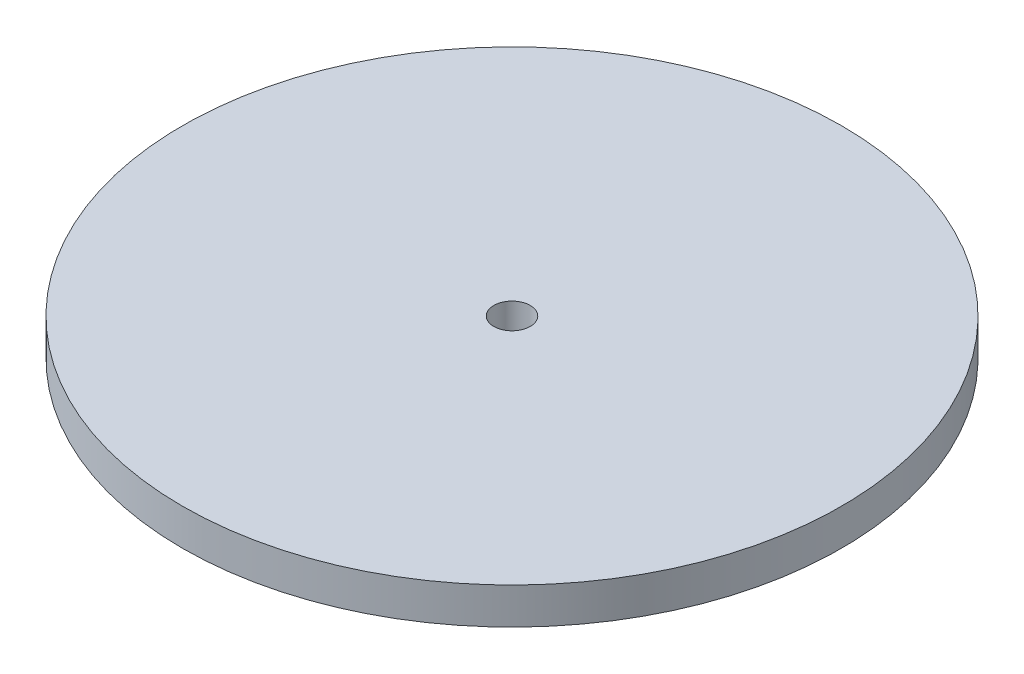
ISO-10303-21;
HEADER;
FILE_DESCRIPTION(('STEP AP214'),'2;1');
FILE_NAME('part.step','',(''),(''),'','','');
FILE_SCHEMA(('AUTOMOTIVE_DESIGN { 1 0 10303 214 1 1 1 1 }'));
ENDSEC;
DATA;
#1=APPLICATION_CONTEXT('core data for automotive mechanical design processes');
#2=APPLICATION_PROTOCOL_DEFINITION('international standard','automotive_design',2000,#1);
#3=PRODUCT_CONTEXT('',#1,'mechanical');
#4=PRODUCT('Part','Part','',(#3));
#5=PRODUCT_RELATED_PRODUCT_CATEGORY('part','',(#4));
#6=PRODUCT_DEFINITION_FORMATION('','',#4);
#7=PRODUCT_DEFINITION_CONTEXT('part definition',#1,'design');
#8=PRODUCT_DEFINITION('design','',#6,#7);
#9=PRODUCT_DEFINITION_SHAPE('','',#8);
#10=(LENGTH_UNIT() NAMED_UNIT(*) SI_UNIT(.MILLI.,.METRE.));
#11=(NAMED_UNIT(*) PLANE_ANGLE_UNIT() SI_UNIT($,.RADIAN.));
#12=(NAMED_UNIT(*) SI_UNIT($,.STERADIAN.) SOLID_ANGLE_UNIT());
#13=UNCERTAINTY_MEASURE_WITH_UNIT(LENGTH_MEASURE(1.E-05),#10,'distance_accuracy_value','');
#14=(GEOMETRIC_REPRESENTATION_CONTEXT(3) GLOBAL_UNCERTAINTY_ASSIGNED_CONTEXT((#13)) GLOBAL_UNIT_ASSIGNED_CONTEXT((#10,
#11,#12)) REPRESENTATION_CONTEXT('',''));
#15=CARTESIAN_POINT('',(0.,0.,0.));
#16=DIRECTION('',(0.,0.,1.));
#17=DIRECTION('',(1.,0.,0.));
#18=AXIS2_PLACEMENT_3D('',#15,#16,#17);
#19=CARTESIAN_POINT('',(0.,4.,0.));
#20=DIRECTION('',(0.,1.,0.));
#21=DIRECTION('',(0.,0.,1.));
#22=AXIS2_PLACEMENT_3D('',#19,#20,#21);
#23=PLANE('',#22);
#24=CARTESIAN_POINT('',(0.,4.,0.));
#25=DIRECTION('',(0.,1.,0.));
#26=DIRECTION('',(0.,0.,1.));
#27=AXIS2_PLACEMENT_3D('',#24,#25,#26);
#28=CIRCLE('',#27,36.15);
#29=CARTESIAN_POINT('',(0.,4.,36.15));
#30=VERTEX_POINT('',#29);
#31=EDGE_CURVE('E10',#30,#30,#28,.T.);
#32=ORIENTED_EDGE('',*,*,#31,.T.);
#33=EDGE_LOOP('',(#32));
#34=FACE_BOUND('',#33,.T.);
#35=CARTESIAN_POINT('',(0.,4.,0.));
#36=DIRECTION('',(0.,1.,0.));
#37=DIRECTION('',(0.,0.,1.));
#38=AXIS2_PLACEMENT_3D('',#35,#36,#37);
#39=CIRCLE('',#38,2.);
#40=CARTESIAN_POINT('',(0.,4.,2.));
#41=VERTEX_POINT('',#40);
#42=EDGE_CURVE('E44',#41,#41,#39,.T.);
#43=ORIENTED_EDGE('',*,*,#42,.F.);
#44=EDGE_LOOP('',(#43));
#45=FACE_BOUND('',#44,.T.);
#46=ADVANCED_FACE('F33',(#34,#45),#23,.T.);
#47=CARTESIAN_POINT('',(0.,0.,0.));
#48=DIRECTION('',(0.,1.,0.));
#49=DIRECTION('',(0.,0.,1.));
#50=AXIS2_PLACEMENT_3D('',#47,#48,#49);
#51=PLANE('',#50);
#52=CARTESIAN_POINT('',(0.,0.,0.));
#53=DIRECTION('',(0.,1.,0.));
#54=DIRECTION('',(0.,0.,1.));
#55=AXIS2_PLACEMENT_3D('',#52,#53,#54);
#56=CIRCLE('',#55,36.15);
#57=CARTESIAN_POINT('',(0.,0.,36.15));
#58=VERTEX_POINT('',#57);
#59=EDGE_CURVE('E37',#58,#58,#56,.T.);
#60=ORIENTED_EDGE('',*,*,#59,.F.);
#61=EDGE_LOOP('',(#60));
#62=FACE_BOUND('',#61,.T.);
#63=CARTESIAN_POINT('',(0.,0.,0.));
#64=DIRECTION('',(0.,1.,0.));
#65=DIRECTION('',(0.,0.,1.));
#66=AXIS2_PLACEMENT_3D('',#63,#64,#65);
#67=CIRCLE('',#66,2.);
#68=CARTESIAN_POINT('',(0.,0.,2.));
#69=VERTEX_POINT('',#68);
#70=EDGE_CURVE('E46',#69,#69,#67,.T.);
#71=ORIENTED_EDGE('',*,*,#70,.T.);
#72=EDGE_LOOP('',(#71));
#73=FACE_BOUND('',#72,.T.);
#74=ADVANCED_FACE('F56',(#62,#73),#51,.F.);
#75=CARTESIAN_POINT('',(0.,4.,0.));
#76=DIRECTION('',(0.,-1.,0.));
#77=DIRECTION('',(0.,0.,-1.));
#78=AXIS2_PLACEMENT_3D('',#75,#76,#77);
#79=CYLINDRICAL_SURFACE('',#78,36.15);
#80=ORIENTED_EDGE('',*,*,#31,.F.);
#81=EDGE_LOOP('',(#80));
#82=FACE_BOUND('',#81,.T.);
#83=ORIENTED_EDGE('',*,*,#59,.T.);
#84=EDGE_LOOP('',(#83));
#85=FACE_BOUND('',#84,.T.);
#86=ADVANCED_FACE('F35',(#82,#85),#79,.T.);
#87=CARTESIAN_POINT('',(0.,4.,0.));
#88=DIRECTION('',(0.,-1.,0.));
#89=DIRECTION('',(0.,0.,-1.));
#90=AXIS2_PLACEMENT_3D('',#87,#88,#89);
#91=CYLINDRICAL_SURFACE('',#90,2.);
#92=ORIENTED_EDGE('',*,*,#42,.T.);
#93=EDGE_LOOP('',(#92));
#94=FACE_BOUND('',#93,.T.);
#95=ORIENTED_EDGE('',*,*,#70,.F.);
#96=EDGE_LOOP('',(#95));
#97=FACE_BOUND('',#96,.T.);
#98=ADVANCED_FACE('F52',(#94,#97),#91,.F.);
#99=CLOSED_SHELL('',(#46,#74,#86,#98));
#100=MANIFOLD_SOLID_BREP('B2',#99);
#101=ADVANCED_BREP_SHAPE_REPRESENTATION('',(#18,#100),#14);
#102=SHAPE_DEFINITION_REPRESENTATION(#9,#101);
ENDSEC;
END-ISO-10303-21;
